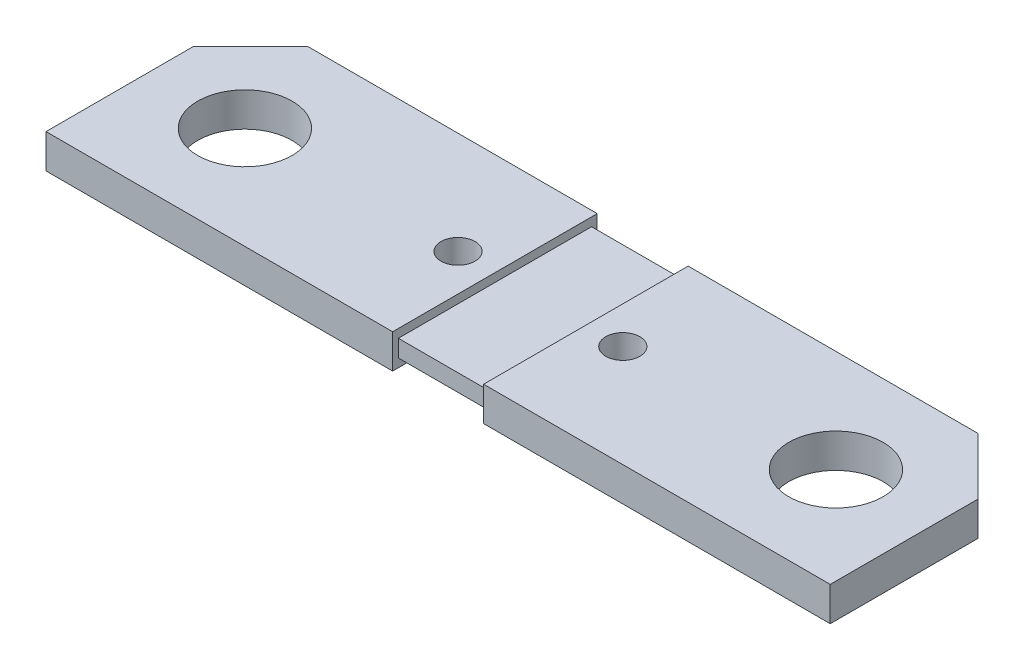
ISO-10303-21;
HEADER;
FILE_DESCRIPTION(('STEP AP214'),'2;1');
FILE_NAME('part.step','',(''),(''),'','','');
FILE_SCHEMA(('AUTOMOTIVE_DESIGN { 1 0 10303 214 1 1 1 1 }'));
ENDSEC;
DATA;
#1=APPLICATION_CONTEXT('core data for automotive mechanical design processes');
#2=APPLICATION_PROTOCOL_DEFINITION('international standard','automotive_design',2000,#1);
#3=PRODUCT_CONTEXT('',#1,'mechanical');
#4=PRODUCT('Part','Part','',(#3));
#5=PRODUCT_RELATED_PRODUCT_CATEGORY('part','',(#4));
#6=PRODUCT_DEFINITION_FORMATION('','',#4);
#7=PRODUCT_DEFINITION_CONTEXT('part definition',#1,'design');
#8=PRODUCT_DEFINITION('design','',#6,#7);
#9=PRODUCT_DEFINITION_SHAPE('','',#8);
#10=(LENGTH_UNIT() NAMED_UNIT(*) SI_UNIT(.MILLI.,.METRE.));
#11=(NAMED_UNIT(*) PLANE_ANGLE_UNIT() SI_UNIT($,.RADIAN.));
#12=(NAMED_UNIT(*) SI_UNIT($,.STERADIAN.) SOLID_ANGLE_UNIT());
#13=UNCERTAINTY_MEASURE_WITH_UNIT(LENGTH_MEASURE(1.E-05),#10,'distance_accuracy_value','');
#14=(GEOMETRIC_REPRESENTATION_CONTEXT(3) GLOBAL_UNCERTAINTY_ASSIGNED_CONTEXT((#13)) GLOBAL_UNIT_ASSIGNED_CONTEXT((#10,
#11,#12)) REPRESENTATION_CONTEXT('',''));
#15=CARTESIAN_POINT('',(0.,0.,0.));
#16=DIRECTION('',(0.,0.,1.));
#17=DIRECTION('',(1.,0.,0.));
#18=AXIS2_PLACEMENT_3D('',#15,#16,#17);
#19=CARTESIAN_POINT('',(0.,1.5,0.));
#20=DIRECTION('',(0.,-1.,0.));
#21=DIRECTION('',(0.,0.,-1.));
#22=AXIS2_PLACEMENT_3D('',#19,#20,#21);
#23=PLANE('',#22);
#24=DIRECTION('',(0.,0.,-1.));
#25=VECTOR('',#24,1.);
#26=CARTESIAN_POINT('',(-4.,1.5,-9.));
#27=LINE('',#26,#25);
#28=CARTESIAN_POINT('',(-4.,1.5,9.));
#29=VERTEX_POINT('',#28);
#30=CARTESIAN_POINT('',(-4.,1.5,-9.));
#31=VERTEX_POINT('',#30);
#32=EDGE_CURVE('E140',#29,#31,#27,.T.);
#33=ORIENTED_EDGE('',*,*,#32,.T.);
#34=DIRECTION('',(-1.,0.,0.));
#35=VECTOR('',#34,1.);
#36=CARTESIAN_POINT('',(-29.5,1.5,-9.));
#37=LINE('',#36,#35);
#38=CARTESIAN_POINT('',(-29.5,1.5,-9.));
#39=VERTEX_POINT('',#38);
#40=EDGE_CURVE('E99',#31,#39,#37,.T.);
#41=ORIENTED_EDGE('',*,*,#40,.T.);
#42=DIRECTION('',(-0.707106781186549,0.,0.707106781186546));
#43=VECTOR('',#42,1.);
#44=CARTESIAN_POINT('',(-34.5,1.5,-4.));
#45=LINE('',#44,#43);
#46=CARTESIAN_POINT('',(-34.5,1.5,-4.));
#47=VERTEX_POINT('',#46);
#48=EDGE_CURVE('E106',#39,#47,#45,.T.);
#49=ORIENTED_EDGE('',*,*,#48,.T.);
#50=DIRECTION('',(0.,0.,1.));
#51=VECTOR('',#50,1.);
#52=CARTESIAN_POINT('',(-34.5,1.5,9.));
#53=LINE('',#52,#51);
#54=CARTESIAN_POINT('',(-34.5,1.5,9.));
#55=VERTEX_POINT('',#54);
#56=EDGE_CURVE('E110',#47,#55,#53,.T.);
#57=ORIENTED_EDGE('',*,*,#56,.T.);
#58=DIRECTION('',(1.,0.,0.));
#59=VECTOR('',#58,1.);
#60=CARTESIAN_POINT('',(-4.,1.5,9.));
#61=LINE('',#60,#59);
#62=EDGE_CURVE('E67',#55,#29,#61,.T.);
#63=ORIENTED_EDGE('',*,*,#62,.T.);
#64=EDGE_LOOP('',(#33,#41,#49,#57,#63));
#65=FACE_BOUND('',#64,.T.);
#66=CARTESIAN_POINT('',(-26.,1.5,0.));
#67=DIRECTION('',(0.,1.,0.));
#68=DIRECTION('',(0.,0.,1.));
#69=AXIS2_PLACEMENT_3D('',#66,#67,#68);
#70=CIRCLE('',#69,4.15);
#71=CARTESIAN_POINT('',(-26.,1.5,4.15));
#72=VERTEX_POINT('',#71);
#73=EDGE_CURVE('E134',#72,#72,#70,.T.);
#74=ORIENTED_EDGE('',*,*,#73,.F.);
#75=EDGE_LOOP('',(#74));
#76=FACE_BOUND('',#75,.T.);
#77=CARTESIAN_POINT('',(-7.25,1.5,0.));
#78=DIRECTION('',(0.,1.,0.));
#79=DIRECTION('',(0.,0.,1.));
#80=AXIS2_PLACEMENT_3D('',#77,#78,#79);
#81=CIRCLE('',#80,1.5);
#82=CARTESIAN_POINT('',(-7.25,1.5,1.5));
#83=VERTEX_POINT('',#82);
#84=EDGE_CURVE('E155',#83,#83,#81,.T.);
#85=ORIENTED_EDGE('',*,*,#84,.F.);
#86=EDGE_LOOP('',(#85));
#87=FACE_BOUND('',#86,.T.);
#88=ADVANCED_FACE('F43',(#65,#76,#87),#23,.F.);
#89=CARTESIAN_POINT('',(0.,-1.5,0.));
#90=DIRECTION('',(0.,-1.,0.));
#91=DIRECTION('',(0.,0.,-1.));
#92=AXIS2_PLACEMENT_3D('',#89,#90,#91);
#93=PLANE('',#92);
#94=CARTESIAN_POINT('',(-26.,-1.5,0.));
#95=DIRECTION('',(0.,1.,0.));
#96=DIRECTION('',(0.,0.,1.));
#97=AXIS2_PLACEMENT_3D('',#94,#95,#96);
#98=CIRCLE('',#97,4.15);
#99=CARTESIAN_POINT('',(-26.,-1.5,4.15));
#100=VERTEX_POINT('',#99);
#101=EDGE_CURVE('E152',#100,#100,#98,.T.);
#102=ORIENTED_EDGE('',*,*,#101,.T.);
#103=EDGE_LOOP('',(#102));
#104=FACE_BOUND('',#103,.T.);
#105=DIRECTION('',(0.,0.,-1.));
#106=VECTOR('',#105,1.);
#107=CARTESIAN_POINT('',(-4.,-1.5,-9.));
#108=LINE('',#107,#106);
#109=CARTESIAN_POINT('',(-4.,-1.5,9.));
#110=VERTEX_POINT('',#109);
#111=CARTESIAN_POINT('',(-4.,-1.5,-9.));
#112=VERTEX_POINT('',#111);
#113=EDGE_CURVE('E130',#110,#112,#108,.T.);
#114=ORIENTED_EDGE('',*,*,#113,.F.);
#115=DIRECTION('',(1.,0.,0.));
#116=VECTOR('',#115,1.);
#117=CARTESIAN_POINT('',(-4.,-1.5,9.));
#118=LINE('',#117,#116);
#119=CARTESIAN_POINT('',(-34.5,-1.5,9.));
#120=VERTEX_POINT('',#119);
#121=EDGE_CURVE('E91',#120,#110,#118,.T.);
#122=ORIENTED_EDGE('',*,*,#121,.F.);
#123=DIRECTION('',(0.,0.,1.));
#124=VECTOR('',#123,1.);
#125=CARTESIAN_POINT('',(-34.5,-1.5,9.));
#126=LINE('',#125,#124);
#127=CARTESIAN_POINT('',(-34.5,-1.5,-4.));
#128=VERTEX_POINT('',#127);
#129=EDGE_CURVE('E137',#128,#120,#126,.T.);
#130=ORIENTED_EDGE('',*,*,#129,.F.);
#131=DIRECTION('',(-0.707106781186549,0.,0.707106781186546));
#132=VECTOR('',#131,1.);
#133=CARTESIAN_POINT('',(-34.5,-1.5,-4.));
#134=LINE('',#133,#132);
#135=CARTESIAN_POINT('',(-29.5,-1.5,-9.));
#136=VERTEX_POINT('',#135);
#137=EDGE_CURVE('E119',#136,#128,#134,.T.);
#138=ORIENTED_EDGE('',*,*,#137,.F.);
#139=DIRECTION('',(-1.,0.,0.));
#140=VECTOR('',#139,1.);
#141=CARTESIAN_POINT('',(-29.5,-1.5,-9.));
#142=LINE('',#141,#140);
#143=EDGE_CURVE('E133',#112,#136,#142,.T.);
#144=ORIENTED_EDGE('',*,*,#143,.F.);
#145=EDGE_LOOP('',(#114,#122,#130,#138,#144));
#146=FACE_BOUND('',#145,.T.);
#147=CARTESIAN_POINT('',(-7.25,-1.5,0.));
#148=DIRECTION('',(0.,1.,0.));
#149=DIRECTION('',(0.,0.,1.));
#150=AXIS2_PLACEMENT_3D('',#147,#148,#149);
#151=CIRCLE('',#150,1.5);
#152=CARTESIAN_POINT('',(-7.25,-1.5,1.5));
#153=VERTEX_POINT('',#152);
#154=EDGE_CURVE('E158',#153,#153,#151,.T.);
#155=ORIENTED_EDGE('',*,*,#154,.T.);
#156=EDGE_LOOP('',(#155));
#157=FACE_BOUND('',#156,.T.);
#158=ADVANCED_FACE('F144',(#104,#146,#157),#93,.T.);
#159=CARTESIAN_POINT('',(-4.,1.5,-9.));
#160=DIRECTION('',(-1.,0.,0.));
#161=DIRECTION('',(0.,0.,1.));
#162=AXIS2_PLACEMENT_3D('',#159,#160,#161);
#163=PLANE('',#162);
#164=DIRECTION('',(0.,-1.,0.));
#165=VECTOR('',#164,1.);
#166=CARTESIAN_POINT('',(-4.,0.75,-8.5));
#167=LINE('',#166,#165);
#168=CARTESIAN_POINT('',(-4.,0.75,-8.5));
#169=VERTEX_POINT('',#168);
#170=CARTESIAN_POINT('',(-4.,-0.75,-8.5));
#171=VERTEX_POINT('',#170);
#172=EDGE_CURVE('E172',#169,#171,#167,.T.);
#173=ORIENTED_EDGE('',*,*,#172,.T.);
#174=DIRECTION('',(0.,0.,1.));
#175=VECTOR('',#174,1.);
#176=CARTESIAN_POINT('',(-4.,-0.75,-8.5));
#177=LINE('',#176,#175);
#178=CARTESIAN_POINT('',(-4.,-0.75,8.5));
#179=VERTEX_POINT('',#178);
#180=EDGE_CURVE('E58',#171,#179,#177,.T.);
#181=ORIENTED_EDGE('',*,*,#180,.T.);
#182=DIRECTION('',(0.,-1.,0.));
#183=VECTOR('',#182,1.);
#184=CARTESIAN_POINT('',(-4.,0.75,8.5));
#185=LINE('',#184,#183);
#186=CARTESIAN_POINT('',(-4.,0.75,8.5));
#187=VERTEX_POINT('',#186);
#188=EDGE_CURVE('E161',#187,#179,#185,.T.);
#189=ORIENTED_EDGE('',*,*,#188,.F.);
#190=DIRECTION('',(0.,0.,1.));
#191=VECTOR('',#190,1.);
#192=CARTESIAN_POINT('',(-4.,0.75,-8.5));
#193=LINE('',#192,#191);
#194=EDGE_CURVE('E178',#169,#187,#193,.T.);
#195=ORIENTED_EDGE('',*,*,#194,.F.);
#196=EDGE_LOOP('',(#173,#181,#189,#195));
#197=FACE_BOUND('',#196,.T.);
#198=ORIENTED_EDGE('',*,*,#113,.T.);
#199=DIRECTION('',(0.,-1.,0.));
#200=VECTOR('',#199,1.);
#201=CARTESIAN_POINT('',(-4.,1.5,-9.));
#202=LINE('',#201,#200);
#203=EDGE_CURVE('E11',#31,#112,#202,.T.);
#204=ORIENTED_EDGE('',*,*,#203,.F.);
#205=ORIENTED_EDGE('',*,*,#32,.F.);
#206=DIRECTION('',(0.,-1.,0.));
#207=VECTOR('',#206,1.);
#208=CARTESIAN_POINT('',(-4.,1.5,9.));
#209=LINE('',#208,#207);
#210=EDGE_CURVE('E126',#29,#110,#209,.T.);
#211=ORIENTED_EDGE('',*,*,#210,.T.);
#212=EDGE_LOOP('',(#198,#204,#205,#211));
#213=FACE_BOUND('',#212,.T.);
#214=ADVANCED_FACE('F45',(#197,#213),#163,.F.);
#215=CARTESIAN_POINT('',(-29.5,1.5,-9.));
#216=DIRECTION('',(0.,0.,1.));
#217=DIRECTION('',(1.,0.,0.));
#218=AXIS2_PLACEMENT_3D('',#215,#216,#217);
#219=PLANE('',#218);
#220=ORIENTED_EDGE('',*,*,#143,.T.);
#221=DIRECTION('',(0.,-1.,0.));
#222=VECTOR('',#221,1.);
#223=CARTESIAN_POINT('',(-29.5,1.5,-9.));
#224=LINE('',#223,#222);
#225=EDGE_CURVE('E51',#39,#136,#224,.T.);
#226=ORIENTED_EDGE('',*,*,#225,.F.);
#227=ORIENTED_EDGE('',*,*,#40,.F.);
#228=ORIENTED_EDGE('',*,*,#203,.T.);
#229=EDGE_LOOP('',(#220,#226,#227,#228));
#230=FACE_BOUND('',#229,.T.);
#231=ADVANCED_FACE('F343',(#230),#219,.F.);
#232=CARTESIAN_POINT('',(-34.5,1.5,-4.));
#233=DIRECTION('',(0.707106781186546,0.,0.707106781186549));
#234=DIRECTION('',(0.707106781186549,0.,-0.707106781186546));
#235=AXIS2_PLACEMENT_3D('',#232,#233,#234);
#236=PLANE('',#235);
#237=ORIENTED_EDGE('',*,*,#137,.T.);
#238=DIRECTION('',(0.,-1.,0.));
#239=VECTOR('',#238,1.);
#240=CARTESIAN_POINT('',(-34.5,1.5,-4.));
#241=LINE('',#240,#239);
#242=EDGE_CURVE('E116',#47,#128,#241,.T.);
#243=ORIENTED_EDGE('',*,*,#242,.F.);
#244=ORIENTED_EDGE('',*,*,#48,.F.);
#245=ORIENTED_EDGE('',*,*,#225,.T.);
#246=EDGE_LOOP('',(#237,#243,#244,#245));
#247=FACE_BOUND('',#246,.T.);
#248=ADVANCED_FACE('F117',(#247),#236,.F.);
#249=CARTESIAN_POINT('',(-34.5,1.5,9.));
#250=DIRECTION('',(1.,0.,0.));
#251=DIRECTION('',(0.,0.,-1.));
#252=AXIS2_PLACEMENT_3D('',#249,#250,#251);
#253=PLANE('',#252);
#254=ORIENTED_EDGE('',*,*,#129,.T.);
#255=DIRECTION('',(0.,-1.,0.));
#256=VECTOR('',#255,1.);
#257=CARTESIAN_POINT('',(-34.5,1.5,9.));
#258=LINE('',#257,#256);
#259=EDGE_CURVE('E122',#55,#120,#258,.T.);
#260=ORIENTED_EDGE('',*,*,#259,.F.);
#261=ORIENTED_EDGE('',*,*,#56,.F.);
#262=ORIENTED_EDGE('',*,*,#242,.T.);
#263=EDGE_LOOP('',(#254,#260,#261,#262));
#264=FACE_BOUND('',#263,.T.);
#265=ADVANCED_FACE('F124',(#264),#253,.F.);
#266=CARTESIAN_POINT('',(-4.,1.5,9.));
#267=DIRECTION('',(0.,0.,-1.));
#268=DIRECTION('',(-1.,0.,0.));
#269=AXIS2_PLACEMENT_3D('',#266,#267,#268);
#270=PLANE('',#269);
#271=ORIENTED_EDGE('',*,*,#121,.T.);
#272=ORIENTED_EDGE('',*,*,#210,.F.);
#273=ORIENTED_EDGE('',*,*,#62,.F.);
#274=ORIENTED_EDGE('',*,*,#259,.T.);
#275=EDGE_LOOP('',(#271,#272,#273,#274));
#276=FACE_BOUND('',#275,.T.);
#277=ADVANCED_FACE('F146',(#276),#270,.F.);
#278=CARTESIAN_POINT('',(-26.,1.5,0.));
#279=DIRECTION('',(0.,-1.,0.));
#280=DIRECTION('',(0.,0.,-1.));
#281=AXIS2_PLACEMENT_3D('',#278,#279,#280);
#282=CYLINDRICAL_SURFACE('',#281,4.15);
#283=ORIENTED_EDGE('',*,*,#73,.T.);
#284=EDGE_LOOP('',(#283));
#285=FACE_BOUND('',#284,.T.);
#286=ORIENTED_EDGE('',*,*,#101,.F.);
#287=EDGE_LOOP('',(#286));
#288=FACE_BOUND('',#287,.T.);
#289=ADVANCED_FACE('F335',(#285,#288),#282,.F.);
#290=CARTESIAN_POINT('',(-7.25,1.5,0.));
#291=DIRECTION('',(0.,-1.,0.));
#292=DIRECTION('',(0.,0.,-1.));
#293=AXIS2_PLACEMENT_3D('',#290,#291,#292);
#294=CYLINDRICAL_SURFACE('',#293,1.5);
#295=ORIENTED_EDGE('',*,*,#84,.T.);
#296=EDGE_LOOP('',(#295));
#297=FACE_BOUND('',#296,.T.);
#298=ORIENTED_EDGE('',*,*,#154,.F.);
#299=EDGE_LOOP('',(#298));
#300=FACE_BOUND('',#299,.T.);
#301=ADVANCED_FACE('F416',(#297,#300),#294,.F.);
#302=CARTESIAN_POINT('',(-4.,0.75,8.5));
#303=DIRECTION('',(0.,0.,-1.));
#304=DIRECTION('',(-1.,0.,0.));
#305=AXIS2_PLACEMENT_3D('',#302,#303,#304);
#306=PLANE('',#305);
#307=DIRECTION('',(1.,0.,0.));
#308=VECTOR('',#307,1.);
#309=CARTESIAN_POINT('',(-4.,-0.75,8.5));
#310=LINE('',#309,#308);
#311=CARTESIAN_POINT('',(4.,-0.75,8.5));
#312=VERTEX_POINT('',#311);
#313=EDGE_CURVE('E182',#179,#312,#310,.T.);
#314=ORIENTED_EDGE('',*,*,#313,.T.);
#315=DIRECTION('',(0.,-1.,0.));
#316=VECTOR('',#315,1.);
#317=CARTESIAN_POINT('',(4.,0.75,8.5));
#318=LINE('',#317,#316);
#319=CARTESIAN_POINT('',(4.,0.75,8.5));
#320=VERTEX_POINT('',#319);
#321=EDGE_CURVE('E166',#320,#312,#318,.T.);
#322=ORIENTED_EDGE('',*,*,#321,.F.);
#323=DIRECTION('',(1.,0.,0.));
#324=VECTOR('',#323,1.);
#325=CARTESIAN_POINT('',(-4.,0.75,8.5));
#326=LINE('',#325,#324);
#327=EDGE_CURVE('E192',#187,#320,#326,.T.);
#328=ORIENTED_EDGE('',*,*,#327,.F.);
#329=ORIENTED_EDGE('',*,*,#188,.T.);
#330=EDGE_LOOP('',(#314,#322,#328,#329));
#331=FACE_BOUND('',#330,.T.);
#332=ADVANCED_FACE('F312',(#331),#306,.F.);
#333=CARTESIAN_POINT('',(-4.,0.75,-8.5));
#334=DIRECTION('',(0.,0.,1.));
#335=DIRECTION('',(1.,0.,0.));
#336=AXIS2_PLACEMENT_3D('',#333,#334,#335);
#337=PLANE('',#336);
#338=DIRECTION('',(-1.,0.,0.));
#339=VECTOR('',#338,1.);
#340=CARTESIAN_POINT('',(-4.,-0.75,-8.5));
#341=LINE('',#340,#339);
#342=CARTESIAN_POINT('',(4.,-0.75,-8.5));
#343=VERTEX_POINT('',#342);
#344=EDGE_CURVE('E176',#343,#171,#341,.T.);
#345=ORIENTED_EDGE('',*,*,#344,.T.);
#346=ORIENTED_EDGE('',*,*,#172,.F.);
#347=DIRECTION('',(-1.,0.,0.));
#348=VECTOR('',#347,1.);
#349=CARTESIAN_POINT('',(-4.,0.75,-8.5));
#350=LINE('',#349,#348);
#351=CARTESIAN_POINT('',(4.,0.75,-8.5));
#352=VERTEX_POINT('',#351);
#353=EDGE_CURVE('E175',#352,#169,#350,.T.);
#354=ORIENTED_EDGE('',*,*,#353,.F.);
#355=DIRECTION('',(0.,-1.,0.));
#356=VECTOR('',#355,1.);
#357=CARTESIAN_POINT('',(4.,0.75,-8.5));
#358=LINE('',#357,#356);
#359=EDGE_CURVE('E169',#352,#343,#358,.T.);
#360=ORIENTED_EDGE('',*,*,#359,.T.);
#361=EDGE_LOOP('',(#345,#346,#354,#360));
#362=FACE_BOUND('',#361,.T.);
#363=ADVANCED_FACE('F306',(#362),#337,.F.);
#364=CARTESIAN_POINT('',(0.,0.75,0.));
#365=DIRECTION('',(0.,1.,0.));
#366=DIRECTION('',(0.,0.,1.));
#367=AXIS2_PLACEMENT_3D('',#364,#365,#366);
#368=PLANE('',#367);
#369=ORIENTED_EDGE('',*,*,#194,.T.);
#370=ORIENTED_EDGE('',*,*,#327,.T.);
#371=DIRECTION('',(0.,0.,-1.));
#372=VECTOR('',#371,1.);
#373=CARTESIAN_POINT('',(4.,0.75,-8.5));
#374=LINE('',#373,#372);
#375=EDGE_CURVE('E189',#320,#352,#374,.T.);
#376=ORIENTED_EDGE('',*,*,#375,.T.);
#377=ORIENTED_EDGE('',*,*,#353,.T.);
#378=EDGE_LOOP('',(#369,#370,#376,#377));
#379=FACE_BOUND('',#378,.T.);
#380=ADVANCED_FACE('F317',(#379),#368,.T.);
#381=CARTESIAN_POINT('',(0.,-0.75,0.));
#382=DIRECTION('',(0.,1.,0.));
#383=DIRECTION('',(0.,0.,1.));
#384=AXIS2_PLACEMENT_3D('',#381,#382,#383);
#385=PLANE('',#384);
#386=ORIENTED_EDGE('',*,*,#180,.F.);
#387=ORIENTED_EDGE('',*,*,#344,.F.);
#388=DIRECTION('',(0.,0.,-1.));
#389=VECTOR('',#388,1.);
#390=CARTESIAN_POINT('',(4.,-0.75,-8.5));
#391=LINE('',#390,#389);
#392=EDGE_CURVE('E179',#312,#343,#391,.T.);
#393=ORIENTED_EDGE('',*,*,#392,.F.);
#394=ORIENTED_EDGE('',*,*,#313,.F.);
#395=EDGE_LOOP('',(#386,#387,#393,#394));
#396=FACE_BOUND('',#395,.T.);
#397=ADVANCED_FACE('F309',(#396),#385,.F.);
#398=CARTESIAN_POINT('',(4.,1.5,-9.));
#399=DIRECTION('',(1.,0.,0.));
#400=DIRECTION('',(0.,0.,-1.));
#401=AXIS2_PLACEMENT_3D('',#398,#399,#400);
#402=PLANE('',#401);
#403=DIRECTION('',(0.,0.,1.));
#404=VECTOR('',#403,1.);
#405=CARTESIAN_POINT('',(4.,-1.5,-9.));
#406=LINE('',#405,#404);
#407=CARTESIAN_POINT('',(4.,-1.5,-9.));
#408=VERTEX_POINT('',#407);
#409=CARTESIAN_POINT('',(4.,-1.5,9.));
#410=VERTEX_POINT('',#409);
#411=EDGE_CURVE('E228',#408,#410,#406,.T.);
#412=ORIENTED_EDGE('',*,*,#411,.T.);
#413=DIRECTION('',(0.,-1.,0.));
#414=VECTOR('',#413,1.);
#415=CARTESIAN_POINT('',(4.,1.5,9.));
#416=LINE('',#415,#414);
#417=CARTESIAN_POINT('',(4.,1.5,9.));
#418=VERTEX_POINT('',#417);
#419=EDGE_CURVE('E247',#418,#410,#416,.T.);
#420=ORIENTED_EDGE('',*,*,#419,.F.);
#421=DIRECTION('',(0.,0.,1.));
#422=VECTOR('',#421,1.);
#423=CARTESIAN_POINT('',(4.,1.5,-9.));
#424=LINE('',#423,#422);
#425=CARTESIAN_POINT('',(4.,1.5,-9.));
#426=VERTEX_POINT('',#425);
#427=EDGE_CURVE('E213',#426,#418,#424,.T.);
#428=ORIENTED_EDGE('',*,*,#427,.F.);
#429=DIRECTION('',(0.,-1.,0.));
#430=VECTOR('',#429,1.);
#431=CARTESIAN_POINT('',(4.,1.5,-9.));
#432=LINE('',#431,#430);
#433=EDGE_CURVE('E250',#426,#408,#432,.T.);
#434=ORIENTED_EDGE('',*,*,#433,.T.);
#435=EDGE_LOOP('',(#412,#420,#428,#434));
#436=FACE_BOUND('',#435,.T.);
#437=ORIENTED_EDGE('',*,*,#321,.T.);
#438=ORIENTED_EDGE('',*,*,#392,.T.);
#439=ORIENTED_EDGE('',*,*,#359,.F.);
#440=ORIENTED_EDGE('',*,*,#375,.F.);
#441=EDGE_LOOP('',(#437,#438,#439,#440));
#442=FACE_BOUND('',#441,.T.);
#443=ADVANCED_FACE('F256',(#436,#442),#402,.F.);
#444=CARTESIAN_POINT('',(0.,1.5,0.));
#445=DIRECTION('',(0.,1.,0.));
#446=DIRECTION('',(0.,0.,1.));
#447=AXIS2_PLACEMENT_3D('',#444,#445,#446);
#448=PLANE('',#447);
#449=CARTESIAN_POINT('',(7.25,1.5,0.));
#450=DIRECTION('',(0.,1.,0.));
#451=DIRECTION('',(0.,0.,-1.));
#452=AXIS2_PLACEMENT_3D('',#449,#450,#451);
#453=CIRCLE('',#452,1.5);
#454=CARTESIAN_POINT('',(7.25,1.5,-1.5));
#455=VERTEX_POINT('',#454);
#456=EDGE_CURVE('E203',#455,#455,#453,.T.);
#457=ORIENTED_EDGE('',*,*,#456,.F.);
#458=EDGE_LOOP('',(#457));
#459=FACE_BOUND('',#458,.T.);
#460=DIRECTION('',(-1.,0.,0.));
#461=VECTOR('',#460,1.);
#462=CARTESIAN_POINT('',(29.5,1.5,-9.));
#463=LINE('',#462,#461);
#464=CARTESIAN_POINT('',(29.5,1.5,-9.));
#465=VERTEX_POINT('',#464);
#466=EDGE_CURVE('E209',#465,#426,#463,.T.);
#467=ORIENTED_EDGE('',*,*,#466,.T.);
#468=ORIENTED_EDGE('',*,*,#427,.T.);
#469=DIRECTION('',(1.,0.,0.));
#470=VECTOR('',#469,1.);
#471=CARTESIAN_POINT('',(4.,1.5,9.));
#472=LINE('',#471,#470);
#473=CARTESIAN_POINT('',(34.5,1.5,9.));
#474=VERTEX_POINT('',#473);
#475=EDGE_CURVE('E216',#418,#474,#472,.T.);
#476=ORIENTED_EDGE('',*,*,#475,.T.);
#477=DIRECTION('',(0.,0.,-1.));
#478=VECTOR('',#477,1.);
#479=CARTESIAN_POINT('',(34.5,1.5,9.));
#480=LINE('',#479,#478);
#481=CARTESIAN_POINT('',(34.5,1.5,-4.));
#482=VERTEX_POINT('',#481);
#483=EDGE_CURVE('E219',#474,#482,#480,.T.);
#484=ORIENTED_EDGE('',*,*,#483,.T.);
#485=DIRECTION('',(-0.707106781186549,0.,-0.707106781186546));
#486=VECTOR('',#485,1.);
#487=CARTESIAN_POINT('',(34.5,1.5,-4.));
#488=LINE('',#487,#486);
#489=EDGE_CURVE('E222',#482,#465,#488,.T.);
#490=ORIENTED_EDGE('',*,*,#489,.T.);
#491=EDGE_LOOP('',(#467,#468,#476,#484,#490));
#492=FACE_BOUND('',#491,.T.);
#493=CARTESIAN_POINT('',(26.,1.5,0.));
#494=DIRECTION('',(0.,1.,0.));
#495=DIRECTION('',(0.,0.,-1.));
#496=AXIS2_PLACEMENT_3D('',#493,#494,#495);
#497=CIRCLE('',#496,4.15);
#498=CARTESIAN_POINT('',(26.,1.5,-4.15));
#499=VERTEX_POINT('',#498);
#500=EDGE_CURVE('E197',#499,#499,#497,.T.);
#501=ORIENTED_EDGE('',*,*,#500,.F.);
#502=EDGE_LOOP('',(#501));
#503=FACE_BOUND('',#502,.T.);
#504=ADVANCED_FACE('F436',(#459,#492,#503),#448,.T.);
#505=CARTESIAN_POINT('',(0.,-1.5,0.));
#506=DIRECTION('',(0.,1.,0.));
#507=DIRECTION('',(0.,0.,1.));
#508=AXIS2_PLACEMENT_3D('',#505,#506,#507);
#509=PLANE('',#508);
#510=DIRECTION('',(-1.,0.,0.));
#511=VECTOR('',#510,1.);
#512=CARTESIAN_POINT('',(29.5,-1.5,-9.));
#513=LINE('',#512,#511);
#514=CARTESIAN_POINT('',(29.5,-1.5,-9.));
#515=VERTEX_POINT('',#514);
#516=EDGE_CURVE('E206',#515,#408,#513,.T.);
#517=ORIENTED_EDGE('',*,*,#516,.F.);
#518=DIRECTION('',(-0.707106781186549,0.,-0.707106781186546));
#519=VECTOR('',#518,1.);
#520=CARTESIAN_POINT('',(34.5,-1.5,-4.));
#521=LINE('',#520,#519);
#522=CARTESIAN_POINT('',(34.5,-1.5,-4.));
#523=VERTEX_POINT('',#522);
#524=EDGE_CURVE('E212',#523,#515,#521,.T.);
#525=ORIENTED_EDGE('',*,*,#524,.F.);
#526=DIRECTION('',(0.,0.,-1.));
#527=VECTOR('',#526,1.);
#528=CARTESIAN_POINT('',(34.5,-1.5,9.));
#529=LINE('',#528,#527);
#530=CARTESIAN_POINT('',(34.5,-1.5,9.));
#531=VERTEX_POINT('',#530);
#532=EDGE_CURVE('E234',#531,#523,#529,.T.);
#533=ORIENTED_EDGE('',*,*,#532,.F.);
#534=DIRECTION('',(1.,0.,0.));
#535=VECTOR('',#534,1.);
#536=CARTESIAN_POINT('',(4.,-1.5,9.));
#537=LINE('',#536,#535);
#538=EDGE_CURVE('E231',#410,#531,#537,.T.);
#539=ORIENTED_EDGE('',*,*,#538,.F.);
#540=ORIENTED_EDGE('',*,*,#411,.F.);
#541=EDGE_LOOP('',(#517,#525,#533,#539,#540));
#542=FACE_BOUND('',#541,.T.);
#543=CARTESIAN_POINT('',(7.25,-1.5,0.));
#544=DIRECTION('',(0.,1.,0.));
#545=DIRECTION('',(0.,0.,-1.));
#546=AXIS2_PLACEMENT_3D('',#543,#544,#545);
#547=CIRCLE('',#546,1.5);
#548=CARTESIAN_POINT('',(7.25,-1.5,-1.5));
#549=VERTEX_POINT('',#548);
#550=EDGE_CURVE('E200',#549,#549,#547,.T.);
#551=ORIENTED_EDGE('',*,*,#550,.T.);
#552=EDGE_LOOP('',(#551));
#553=FACE_BOUND('',#552,.T.);
#554=CARTESIAN_POINT('',(26.,-1.5,0.));
#555=DIRECTION('',(0.,1.,0.));
#556=DIRECTION('',(0.,0.,-1.));
#557=AXIS2_PLACEMENT_3D('',#554,#555,#556);
#558=CIRCLE('',#557,4.15);
#559=CARTESIAN_POINT('',(26.,-1.5,-4.15));
#560=VERTEX_POINT('',#559);
#561=EDGE_CURVE('E186',#560,#560,#558,.T.);
#562=ORIENTED_EDGE('',*,*,#561,.T.);
#563=EDGE_LOOP('',(#562));
#564=FACE_BOUND('',#563,.T.);
#565=ADVANCED_FACE('F272',(#542,#553,#564),#509,.F.);
#566=CARTESIAN_POINT('',(29.5,1.5,-9.));
#567=DIRECTION('',(0.,0.,1.));
#568=DIRECTION('',(1.,0.,0.));
#569=AXIS2_PLACEMENT_3D('',#566,#567,#568);
#570=PLANE('',#569);
#571=ORIENTED_EDGE('',*,*,#516,.T.);
#572=ORIENTED_EDGE('',*,*,#433,.F.);
#573=ORIENTED_EDGE('',*,*,#466,.F.);
#574=DIRECTION('',(0.,-1.,0.));
#575=VECTOR('',#574,1.);
#576=CARTESIAN_POINT('',(29.5,1.5,-9.));
#577=LINE('',#576,#575);
#578=EDGE_CURVE('E225',#465,#515,#577,.T.);
#579=ORIENTED_EDGE('',*,*,#578,.T.);
#580=EDGE_LOOP('',(#571,#572,#573,#579));
#581=FACE_BOUND('',#580,.T.);
#582=ADVANCED_FACE('F267',(#581),#570,.F.);
#583=CARTESIAN_POINT('',(4.,1.5,9.));
#584=DIRECTION('',(0.,0.,-1.));
#585=DIRECTION('',(-1.,0.,0.));
#586=AXIS2_PLACEMENT_3D('',#583,#584,#585);
#587=PLANE('',#586);
#588=ORIENTED_EDGE('',*,*,#538,.T.);
#589=DIRECTION('',(0.,-1.,0.));
#590=VECTOR('',#589,1.);
#591=CARTESIAN_POINT('',(34.5,1.5,9.));
#592=LINE('',#591,#590);
#593=EDGE_CURVE('E244',#474,#531,#592,.T.);
#594=ORIENTED_EDGE('',*,*,#593,.F.);
#595=ORIENTED_EDGE('',*,*,#475,.F.);
#596=ORIENTED_EDGE('',*,*,#419,.T.);
#597=EDGE_LOOP('',(#588,#594,#595,#596));
#598=FACE_BOUND('',#597,.T.);
#599=ADVANCED_FACE('F464',(#598),#587,.F.);
#600=CARTESIAN_POINT('',(34.5,1.5,9.));
#601=DIRECTION('',(-1.,0.,0.));
#602=DIRECTION('',(0.,0.,1.));
#603=AXIS2_PLACEMENT_3D('',#600,#601,#602);
#604=PLANE('',#603);
#605=ORIENTED_EDGE('',*,*,#532,.T.);
#606=DIRECTION('',(0.,-1.,0.));
#607=VECTOR('',#606,1.);
#608=CARTESIAN_POINT('',(34.5,1.5,-4.));
#609=LINE('',#608,#607);
#610=EDGE_CURVE('E241',#482,#523,#609,.T.);
#611=ORIENTED_EDGE('',*,*,#610,.F.);
#612=ORIENTED_EDGE('',*,*,#483,.F.);
#613=ORIENTED_EDGE('',*,*,#593,.T.);
#614=EDGE_LOOP('',(#605,#611,#612,#613));
#615=FACE_BOUND('',#614,.T.);
#616=ADVANCED_FACE('F473',(#615),#604,.F.);
#617=CARTESIAN_POINT('',(34.5,1.5,-4.));
#618=DIRECTION('',(-0.707106781186546,0.,0.707106781186549));
#619=DIRECTION('',(0.707106781186549,0.,0.707106781186546));
#620=AXIS2_PLACEMENT_3D('',#617,#618,#619);
#621=PLANE('',#620);
#622=ORIENTED_EDGE('',*,*,#524,.T.);
#623=ORIENTED_EDGE('',*,*,#578,.F.);
#624=ORIENTED_EDGE('',*,*,#489,.F.);
#625=ORIENTED_EDGE('',*,*,#610,.T.);
#626=EDGE_LOOP('',(#622,#623,#624,#625));
#627=FACE_BOUND('',#626,.T.);
#628=ADVANCED_FACE('F483',(#627),#621,.F.);
#629=CARTESIAN_POINT('',(7.25,1.5,0.));
#630=DIRECTION('',(0.,-1.,0.));
#631=DIRECTION('',(0.,0.,-1.));
#632=AXIS2_PLACEMENT_3D('',#629,#630,#631);
#633=CYLINDRICAL_SURFACE('',#632,1.5);
#634=ORIENTED_EDGE('',*,*,#456,.T.);
#635=EDGE_LOOP('',(#634));
#636=FACE_BOUND('',#635,.T.);
#637=ORIENTED_EDGE('',*,*,#550,.F.);
#638=EDGE_LOOP('',(#637));
#639=FACE_BOUND('',#638,.T.);
#640=ADVANCED_FACE('F493',(#636,#639),#633,.F.);
#641=CARTESIAN_POINT('',(26.,1.5,0.));
#642=DIRECTION('',(0.,-1.,0.));
#643=DIRECTION('',(0.,0.,-1.));
#644=AXIS2_PLACEMENT_3D('',#641,#642,#643);
#645=CYLINDRICAL_SURFACE('',#644,4.15);
#646=ORIENTED_EDGE('',*,*,#500,.T.);
#647=EDGE_LOOP('',(#646));
#648=FACE_BOUND('',#647,.T.);
#649=ORIENTED_EDGE('',*,*,#561,.F.);
#650=EDGE_LOOP('',(#649));
#651=FACE_BOUND('',#650,.T.);
#652=ADVANCED_FACE('F502',(#648,#651),#645,.F.);
#653=CLOSED_SHELL('',(#88,#158,#214,#231,#248,#265,#277,#289,#301,#332,#363,#380,#397,#443,#504,
#565,#582,#599,#616,#628,#640,#652));
#654=MANIFOLD_SOLID_BREP('B2',#653);
#655=ADVANCED_BREP_SHAPE_REPRESENTATION('',(#18,#654),#14);
#656=SHAPE_DEFINITION_REPRESENTATION(#9,#655);
ENDSEC;
END-ISO-10303-21;
